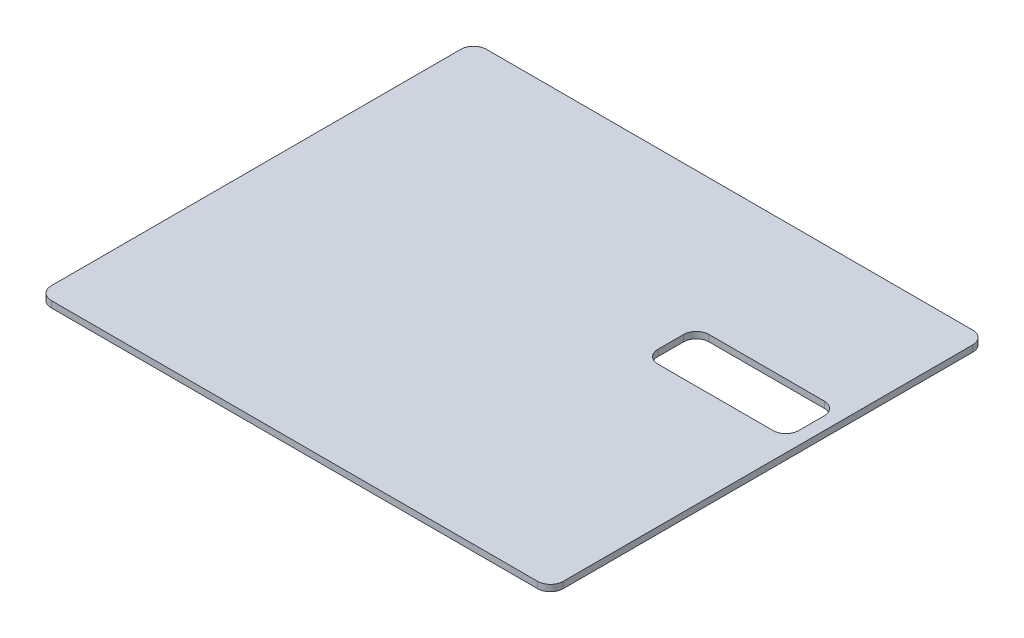
ISO-10303-21;
HEADER;
FILE_DESCRIPTION(('STEP AP214'),'2;1');
FILE_NAME('part.step','',(''),(''),'','','');
FILE_SCHEMA(('AUTOMOTIVE_DESIGN { 1 0 10303 214 1 1 1 1 }'));
ENDSEC;
DATA;
#1=APPLICATION_CONTEXT('core data for automotive mechanical design processes');
#2=APPLICATION_PROTOCOL_DEFINITION('international standard','automotive_design',2000,#1);
#3=PRODUCT_CONTEXT('',#1,'mechanical');
#4=PRODUCT('Part','Part','',(#3));
#5=PRODUCT_RELATED_PRODUCT_CATEGORY('part','',(#4));
#6=PRODUCT_DEFINITION_FORMATION('','',#4);
#7=PRODUCT_DEFINITION_CONTEXT('part definition',#1,'design');
#8=PRODUCT_DEFINITION('design','',#6,#7);
#9=PRODUCT_DEFINITION_SHAPE('','',#8);
#10=(LENGTH_UNIT() NAMED_UNIT(*) SI_UNIT(.MILLI.,.METRE.));
#11=(NAMED_UNIT(*) PLANE_ANGLE_UNIT() SI_UNIT($,.RADIAN.));
#12=(NAMED_UNIT(*) SI_UNIT($,.STERADIAN.) SOLID_ANGLE_UNIT());
#13=UNCERTAINTY_MEASURE_WITH_UNIT(LENGTH_MEASURE(1.E-05),#10,'distance_accuracy_value','');
#14=(GEOMETRIC_REPRESENTATION_CONTEXT(3) GLOBAL_UNCERTAINTY_ASSIGNED_CONTEXT((#13)) GLOBAL_UNIT_ASSIGNED_CONTEXT((#10,
#11,#12)) REPRESENTATION_CONTEXT('',''));
#15=CARTESIAN_POINT('',(0.,0.,0.));
#16=DIRECTION('',(0.,0.,1.));
#17=DIRECTION('',(1.,0.,0.));
#18=AXIS2_PLACEMENT_3D('',#15,#16,#17);
#19=CARTESIAN_POINT('',(0.,3.175,0.));
#20=DIRECTION('',(0.,-1.,0.));
#21=DIRECTION('',(0.,0.,-1.));
#22=AXIS2_PLACEMENT_3D('',#19,#20,#21);
#23=PLANE('',#22);
#24=DIRECTION('',(0.,0.,-1.));
#25=VECTOR('',#24,1.);
#26=CARTESIAN_POINT('',(254.,3.175,0.));
#27=LINE('',#26,#25);
#28=CARTESIAN_POINT('',(254.,3.175,-6.34999999999999));
#29=VERTEX_POINT('',#28);
#30=CARTESIAN_POINT('',(254.,3.175,-209.55));
#31=VERTEX_POINT('',#30);
#32=EDGE_CURVE('E179',#29,#31,#27,.T.);
#33=ORIENTED_EDGE('',*,*,#32,.T.);
#34=CARTESIAN_POINT('',(247.65,3.175,-209.55));
#35=DIRECTION('',(0.,-1.,0.));
#36=DIRECTION('',(0.,0.,-1.));
#37=AXIS2_PLACEMENT_3D('',#34,#35,#36);
#38=CIRCLE('',#37,6.35);
#39=CARTESIAN_POINT('',(247.65,3.175,-215.9));
#40=VERTEX_POINT('',#39);
#41=EDGE_CURVE('E221',#31,#40,#38,.F.);
#42=ORIENTED_EDGE('',*,*,#41,.T.);
#43=DIRECTION('',(-1.,0.,0.));
#44=VECTOR('',#43,1.);
#45=CARTESIAN_POINT('',(0.,3.175,-215.9));
#46=LINE('',#45,#44);
#47=CARTESIAN_POINT('',(6.35,3.175,-215.9));
#48=VERTEX_POINT('',#47);
#49=EDGE_CURVE('E174',#40,#48,#46,.T.);
#50=ORIENTED_EDGE('',*,*,#49,.T.);
#51=CARTESIAN_POINT('',(6.35,3.175,-209.55));
#52=DIRECTION('',(0.,-1.,0.));
#53=DIRECTION('',(0.,0.,-1.));
#54=AXIS2_PLACEMENT_3D('',#51,#52,#53);
#55=CIRCLE('',#54,6.35);
#56=CARTESIAN_POINT('',(0.,3.175,-209.55));
#57=VERTEX_POINT('',#56);
#58=EDGE_CURVE('E219',#48,#57,#55,.F.);
#59=ORIENTED_EDGE('',*,*,#58,.T.);
#60=DIRECTION('',(0.,0.,1.));
#61=VECTOR('',#60,1.);
#62=CARTESIAN_POINT('',(0.,3.175,0.));
#63=LINE('',#62,#61);
#64=CARTESIAN_POINT('',(0.,3.175,-6.35));
#65=VERTEX_POINT('',#64);
#66=EDGE_CURVE('E271',#57,#65,#63,.T.);
#67=ORIENTED_EDGE('',*,*,#66,.T.);
#68=CARTESIAN_POINT('',(6.35,3.175,-6.35));
#69=DIRECTION('',(0.,-1.,0.));
#70=DIRECTION('',(0.,0.,-1.));
#71=AXIS2_PLACEMENT_3D('',#68,#69,#70);
#72=CIRCLE('',#71,6.35);
#73=CARTESIAN_POINT('',(6.35,3.175,0.));
#74=VERTEX_POINT('',#73);
#75=EDGE_CURVE('E59',#65,#74,#72,.F.);
#76=ORIENTED_EDGE('',*,*,#75,.T.);
#77=DIRECTION('',(1.,0.,0.));
#78=VECTOR('',#77,1.);
#79=CARTESIAN_POINT('',(0.,3.175,0.));
#80=LINE('',#79,#78);
#81=CARTESIAN_POINT('',(247.65,3.175,0.));
#82=VERTEX_POINT('',#81);
#83=EDGE_CURVE('E273',#74,#82,#80,.T.);
#84=ORIENTED_EDGE('',*,*,#83,.T.);
#85=CARTESIAN_POINT('',(247.65,3.175,-6.34999999999999));
#86=DIRECTION('',(0.,-1.,0.));
#87=DIRECTION('',(0.,0.,-1.));
#88=AXIS2_PLACEMENT_3D('',#85,#86,#87);
#89=CIRCLE('',#88,6.35);
#90=EDGE_CURVE('E216',#82,#29,#89,.F.);
#91=ORIENTED_EDGE('',*,*,#90,.T.);
#92=EDGE_LOOP('',(#33,#42,#50,#59,#67,#76,#84,#91));
#93=FACE_BOUND('',#92,.T.);
#94=DIRECTION('',(0.,0.,1.));
#95=VECTOR('',#94,1.);
#96=CARTESIAN_POINT('',(177.8,3.175,-123.19));
#97=LINE('',#96,#95);
#98=CARTESIAN_POINT('',(177.8,3.175,-142.24));
#99=VERTEX_POINT('',#98);
#100=CARTESIAN_POINT('',(177.8,3.175,-129.54));
#101=VERTEX_POINT('',#100);
#102=EDGE_CURVE('E250',#99,#101,#97,.T.);
#103=ORIENTED_EDGE('',*,*,#102,.F.);
#104=CARTESIAN_POINT('',(184.15,3.175,-142.24));
#105=DIRECTION('',(0.,-1.,0.));
#106=DIRECTION('',(0.,0.,-1.));
#107=AXIS2_PLACEMENT_3D('',#104,#105,#106);
#108=CIRCLE('',#107,6.35);
#109=CARTESIAN_POINT('',(184.15,3.175,-148.59));
#110=VERTEX_POINT('',#109);
#111=EDGE_CURVE('E161',#99,#110,#108,.T.);
#112=ORIENTED_EDGE('',*,*,#111,.T.);
#113=DIRECTION('',(-1.,0.,0.));
#114=VECTOR('',#113,1.);
#115=CARTESIAN_POINT('',(247.65,3.175,-148.59));
#116=LINE('',#115,#114);
#117=CARTESIAN_POINT('',(241.3,3.175,-148.59));
#118=VERTEX_POINT('',#117);
#119=EDGE_CURVE('E247',#118,#110,#116,.T.);
#120=ORIENTED_EDGE('',*,*,#119,.F.);
#121=CARTESIAN_POINT('',(241.3,3.175,-142.24));
#122=DIRECTION('',(0.,-1.,0.));
#123=DIRECTION('',(0.,0.,-1.));
#124=AXIS2_PLACEMENT_3D('',#121,#122,#123);
#125=CIRCLE('',#124,6.35);
#126=CARTESIAN_POINT('',(247.65,3.175,-142.24));
#127=VERTEX_POINT('',#126);
#128=EDGE_CURVE('E238',#118,#127,#125,.T.);
#129=ORIENTED_EDGE('',*,*,#128,.T.);
#130=DIRECTION('',(0.,0.,-1.));
#131=VECTOR('',#130,1.);
#132=CARTESIAN_POINT('',(247.65,3.175,-123.19));
#133=LINE('',#132,#131);
#134=CARTESIAN_POINT('',(247.65,3.175,-129.54));
#135=VERTEX_POINT('',#134);
#136=EDGE_CURVE('E260',#135,#127,#133,.T.);
#137=ORIENTED_EDGE('',*,*,#136,.F.);
#138=CARTESIAN_POINT('',(241.3,3.175,-129.54));
#139=DIRECTION('',(0.,-1.,0.));
#140=DIRECTION('',(0.,0.,-1.));
#141=AXIS2_PLACEMENT_3D('',#138,#139,#140);
#142=CIRCLE('',#141,6.35);
#143=CARTESIAN_POINT('',(241.3,3.175,-123.19));
#144=VERTEX_POINT('',#143);
#145=EDGE_CURVE('E234',#135,#144,#142,.T.);
#146=ORIENTED_EDGE('',*,*,#145,.T.);
#147=DIRECTION('',(1.,0.,0.));
#148=VECTOR('',#147,1.);
#149=CARTESIAN_POINT('',(247.65,3.175,-123.19));
#150=LINE('',#149,#148);
#151=CARTESIAN_POINT('',(184.15,3.175,-123.19));
#152=VERTEX_POINT('',#151);
#153=EDGE_CURVE('E480',#152,#144,#150,.T.);
#154=ORIENTED_EDGE('',*,*,#153,.F.);
#155=CARTESIAN_POINT('',(184.15,3.175,-129.54));
#156=DIRECTION('',(0.,-1.,0.));
#157=DIRECTION('',(0.,0.,-1.));
#158=AXIS2_PLACEMENT_3D('',#155,#156,#157);
#159=CIRCLE('',#158,6.35);
#160=EDGE_CURVE('E11',#152,#101,#159,.T.);
#161=ORIENTED_EDGE('',*,*,#160,.T.);
#162=EDGE_LOOP('',(#103,#112,#120,#129,#137,#146,#154,#161));
#163=FACE_BOUND('',#162,.T.);
#164=ADVANCED_FACE('F37',(#93,#163),#23,.F.);
#165=CARTESIAN_POINT('',(0.,0.,0.));
#166=DIRECTION('',(0.,-1.,0.));
#167=DIRECTION('',(0.,0.,-1.));
#168=AXIS2_PLACEMENT_3D('',#165,#166,#167);
#169=PLANE('',#168);
#170=DIRECTION('',(-1.,0.,0.));
#171=VECTOR('',#170,1.);
#172=CARTESIAN_POINT('',(0.,0.,-215.9));
#173=LINE('',#172,#171);
#174=CARTESIAN_POINT('',(247.65,0.,-215.9));
#175=VERTEX_POINT('',#174);
#176=CARTESIAN_POINT('',(6.35,0.,-215.9));
#177=VERTEX_POINT('',#176);
#178=EDGE_CURVE('E182',#175,#177,#173,.T.);
#179=ORIENTED_EDGE('',*,*,#178,.F.);
#180=CARTESIAN_POINT('',(247.65,0.,-209.55));
#181=DIRECTION('',(0.,-1.,0.));
#182=DIRECTION('',(0.,0.,-1.));
#183=AXIS2_PLACEMENT_3D('',#180,#181,#182);
#184=CIRCLE('',#183,6.35);
#185=CARTESIAN_POINT('',(254.,0.,-209.55));
#186=VERTEX_POINT('',#185);
#187=EDGE_CURVE('E209',#175,#186,#184,.T.);
#188=ORIENTED_EDGE('',*,*,#187,.T.);
#189=DIRECTION('',(0.,0.,-1.));
#190=VECTOR('',#189,1.);
#191=CARTESIAN_POINT('',(254.,0.,-148.59));
#192=LINE('',#191,#190);
#193=CARTESIAN_POINT('',(254.,0.,-6.34999999999999));
#194=VERTEX_POINT('',#193);
#195=EDGE_CURVE('E280',#194,#186,#192,.T.);
#196=ORIENTED_EDGE('',*,*,#195,.F.);
#197=CARTESIAN_POINT('',(247.65,0.,-6.34999999999999));
#198=DIRECTION('',(0.,-1.,0.));
#199=DIRECTION('',(0.,0.,-1.));
#200=AXIS2_PLACEMENT_3D('',#197,#198,#199);
#201=CIRCLE('',#200,6.35);
#202=CARTESIAN_POINT('',(247.65,0.,0.));
#203=VERTEX_POINT('',#202);
#204=EDGE_CURVE('E203',#194,#203,#201,.T.);
#205=ORIENTED_EDGE('',*,*,#204,.T.);
#206=DIRECTION('',(1.,0.,0.));
#207=VECTOR('',#206,1.);
#208=CARTESIAN_POINT('',(0.,0.,0.));
#209=LINE('',#208,#207);
#210=CARTESIAN_POINT('',(6.35,0.,0.));
#211=VERTEX_POINT('',#210);
#212=EDGE_CURVE('E279',#211,#203,#209,.T.);
#213=ORIENTED_EDGE('',*,*,#212,.F.);
#214=CARTESIAN_POINT('',(6.35,0.,-6.35));
#215=DIRECTION('',(0.,-1.,0.));
#216=DIRECTION('',(0.,0.,-1.));
#217=AXIS2_PLACEMENT_3D('',#214,#215,#216);
#218=CIRCLE('',#217,6.35);
#219=CARTESIAN_POINT('',(0.,0.,-6.35));
#220=VERTEX_POINT('',#219);
#221=EDGE_CURVE('E205',#211,#220,#218,.T.);
#222=ORIENTED_EDGE('',*,*,#221,.T.);
#223=DIRECTION('',(0.,0.,1.));
#224=VECTOR('',#223,1.);
#225=CARTESIAN_POINT('',(0.,0.,0.));
#226=LINE('',#225,#224);
#227=CARTESIAN_POINT('',(0.,0.,-209.55));
#228=VERTEX_POINT('',#227);
#229=EDGE_CURVE('E259',#228,#220,#226,.T.);
#230=ORIENTED_EDGE('',*,*,#229,.F.);
#231=CARTESIAN_POINT('',(6.35,0.,-209.55));
#232=DIRECTION('',(0.,-1.,0.));
#233=DIRECTION('',(0.,0.,-1.));
#234=AXIS2_PLACEMENT_3D('',#231,#232,#233);
#235=CIRCLE('',#234,6.35);
#236=EDGE_CURVE('E207',#228,#177,#235,.T.);
#237=ORIENTED_EDGE('',*,*,#236,.T.);
#238=EDGE_LOOP('',(#179,#188,#196,#205,#213,#222,#230,#237));
#239=FACE_BOUND('',#238,.T.);
#240=DIRECTION('',(0.,0.,-1.));
#241=VECTOR('',#240,1.);
#242=CARTESIAN_POINT('',(247.65,0.,-123.19));
#243=LINE('',#242,#241);
#244=CARTESIAN_POINT('',(247.65,0.,-129.54));
#245=VERTEX_POINT('',#244);
#246=CARTESIAN_POINT('',(247.65,0.,-142.24));
#247=VERTEX_POINT('',#246);
#248=EDGE_CURVE('E170',#245,#247,#243,.T.);
#249=ORIENTED_EDGE('',*,*,#248,.T.);
#250=CARTESIAN_POINT('',(241.3,0.,-142.24));
#251=DIRECTION('',(0.,-1.,0.));
#252=DIRECTION('',(0.,0.,-1.));
#253=AXIS2_PLACEMENT_3D('',#250,#251,#252);
#254=CIRCLE('',#253,6.35);
#255=CARTESIAN_POINT('',(241.3,0.,-148.59));
#256=VERTEX_POINT('',#255);
#257=EDGE_CURVE('E236',#247,#256,#254,.F.);
#258=ORIENTED_EDGE('',*,*,#257,.T.);
#259=DIRECTION('',(-1.,0.,0.));
#260=VECTOR('',#259,1.);
#261=CARTESIAN_POINT('',(247.65,0.,-148.59));
#262=LINE('',#261,#260);
#263=CARTESIAN_POINT('',(184.15,0.,-148.59));
#264=VERTEX_POINT('',#263);
#265=EDGE_CURVE('E263',#256,#264,#262,.T.);
#266=ORIENTED_EDGE('',*,*,#265,.T.);
#267=CARTESIAN_POINT('',(184.15,0.,-142.24));
#268=DIRECTION('',(0.,-1.,0.));
#269=DIRECTION('',(0.,0.,-1.));
#270=AXIS2_PLACEMENT_3D('',#267,#268,#269);
#271=CIRCLE('',#270,6.35);
#272=CARTESIAN_POINT('',(177.8,0.,-142.24));
#273=VERTEX_POINT('',#272);
#274=EDGE_CURVE('E240',#264,#273,#271,.F.);
#275=ORIENTED_EDGE('',*,*,#274,.T.);
#276=DIRECTION('',(0.,0.,1.));
#277=VECTOR('',#276,1.);
#278=CARTESIAN_POINT('',(177.8,0.,-123.19));
#279=LINE('',#278,#277);
#280=CARTESIAN_POINT('',(177.8,0.,-129.54));
#281=VERTEX_POINT('',#280);
#282=EDGE_CURVE('E156',#273,#281,#279,.T.);
#283=ORIENTED_EDGE('',*,*,#282,.T.);
#284=CARTESIAN_POINT('',(184.15,0.,-129.54));
#285=DIRECTION('',(0.,-1.,0.));
#286=DIRECTION('',(0.,0.,-1.));
#287=AXIS2_PLACEMENT_3D('',#284,#285,#286);
#288=CIRCLE('',#287,6.35);
#289=CARTESIAN_POINT('',(184.15,0.,-123.19));
#290=VERTEX_POINT('',#289);
#291=EDGE_CURVE('E45',#281,#290,#288,.F.);
#292=ORIENTED_EDGE('',*,*,#291,.T.);
#293=DIRECTION('',(1.,0.,0.));
#294=VECTOR('',#293,1.);
#295=CARTESIAN_POINT('',(247.65,0.,-123.19));
#296=LINE('',#295,#294);
#297=CARTESIAN_POINT('',(241.3,0.,-123.19));
#298=VERTEX_POINT('',#297);
#299=EDGE_CURVE('E154',#290,#298,#296,.T.);
#300=ORIENTED_EDGE('',*,*,#299,.T.);
#301=CARTESIAN_POINT('',(241.3,0.,-129.54));
#302=DIRECTION('',(0.,-1.,0.));
#303=DIRECTION('',(0.,0.,-1.));
#304=AXIS2_PLACEMENT_3D('',#301,#302,#303);
#305=CIRCLE('',#304,6.35);
#306=EDGE_CURVE('E232',#298,#245,#305,.F.);
#307=ORIENTED_EDGE('',*,*,#306,.T.);
#308=EDGE_LOOP('',(#249,#258,#266,#275,#283,#292,#300,#307));
#309=FACE_BOUND('',#308,.T.);
#310=ADVANCED_FACE('F153',(#239,#309),#169,.T.);
#311=CARTESIAN_POINT('',(0.,3.175,0.));
#312=DIRECTION('',(1.,0.,0.));
#313=DIRECTION('',(0.,0.,-1.));
#314=AXIS2_PLACEMENT_3D('',#311,#312,#313);
#315=PLANE('',#314);
#316=ORIENTED_EDGE('',*,*,#66,.F.);
#317=DIRECTION('',(0.,-1.,0.));
#318=VECTOR('',#317,1.);
#319=CARTESIAN_POINT('',(0.,3.175,-209.55));
#320=LINE('',#319,#318);
#321=EDGE_CURVE('E225',#57,#228,#320,.T.);
#322=ORIENTED_EDGE('',*,*,#321,.T.);
#323=ORIENTED_EDGE('',*,*,#229,.T.);
#324=DIRECTION('',(0.,-1.,0.));
#325=VECTOR('',#324,1.);
#326=CARTESIAN_POINT('',(0.,3.175,-6.35));
#327=LINE('',#326,#325);
#328=EDGE_CURVE('E223',#220,#65,#327,.F.);
#329=ORIENTED_EDGE('',*,*,#328,.T.);
#330=EDGE_LOOP('',(#316,#322,#323,#329));
#331=FACE_BOUND('',#330,.T.);
#332=ADVANCED_FACE('F299',(#331),#315,.F.);
#333=CARTESIAN_POINT('',(0.,3.175,0.));
#334=DIRECTION('',(0.,0.,-1.));
#335=DIRECTION('',(-1.,0.,0.));
#336=AXIS2_PLACEMENT_3D('',#333,#334,#335);
#337=PLANE('',#336);
#338=ORIENTED_EDGE('',*,*,#83,.F.);
#339=DIRECTION('',(0.,-1.,0.));
#340=VECTOR('',#339,1.);
#341=CARTESIAN_POINT('',(6.35,3.175,0.));
#342=LINE('',#341,#340);
#343=EDGE_CURVE('E229',#74,#211,#342,.T.);
#344=ORIENTED_EDGE('',*,*,#343,.T.);
#345=ORIENTED_EDGE('',*,*,#212,.T.);
#346=DIRECTION('',(0.,-1.,0.));
#347=VECTOR('',#346,1.);
#348=CARTESIAN_POINT('',(247.65,3.175,0.));
#349=LINE('',#348,#347);
#350=EDGE_CURVE('E52',#203,#82,#349,.F.);
#351=ORIENTED_EDGE('',*,*,#350,.T.);
#352=EDGE_LOOP('',(#338,#344,#345,#351));
#353=FACE_BOUND('',#352,.T.);
#354=ADVANCED_FACE('F306',(#353),#337,.F.);
#355=CARTESIAN_POINT('',(254.,3.175,-148.59));
#356=DIRECTION('',(-1.,0.,0.));
#357=DIRECTION('',(0.,0.,1.));
#358=AXIS2_PLACEMENT_3D('',#355,#356,#357);
#359=PLANE('',#358);
#360=ORIENTED_EDGE('',*,*,#195,.T.);
#361=DIRECTION('',(0.,-1.,0.));
#362=VECTOR('',#361,1.);
#363=CARTESIAN_POINT('',(254.,3.175,-209.55));
#364=LINE('',#363,#362);
#365=EDGE_CURVE('E214',#186,#31,#364,.F.);
#366=ORIENTED_EDGE('',*,*,#365,.T.);
#367=ORIENTED_EDGE('',*,*,#32,.F.);
#368=DIRECTION('',(0.,-1.,0.));
#369=VECTOR('',#368,1.);
#370=CARTESIAN_POINT('',(254.,3.175,-6.34999999999999));
#371=LINE('',#370,#369);
#372=EDGE_CURVE('E211',#29,#194,#371,.T.);
#373=ORIENTED_EDGE('',*,*,#372,.T.);
#374=EDGE_LOOP('',(#360,#366,#367,#373));
#375=FACE_BOUND('',#374,.T.);
#376=ADVANCED_FACE('F311',(#375),#359,.F.);
#377=CARTESIAN_POINT('',(0.,3.175,-215.9));
#378=DIRECTION('',(0.,0.,1.));
#379=DIRECTION('',(1.,0.,0.));
#380=AXIS2_PLACEMENT_3D('',#377,#378,#379);
#381=PLANE('',#380);
#382=ORIENTED_EDGE('',*,*,#49,.F.);
#383=DIRECTION('',(0.,-1.,0.));
#384=VECTOR('',#383,1.);
#385=CARTESIAN_POINT('',(247.65,3.175,-215.9));
#386=LINE('',#385,#384);
#387=EDGE_CURVE('E200',#40,#175,#386,.T.);
#388=ORIENTED_EDGE('',*,*,#387,.T.);
#389=ORIENTED_EDGE('',*,*,#178,.T.);
#390=DIRECTION('',(0.,-1.,0.));
#391=VECTOR('',#390,1.);
#392=CARTESIAN_POINT('',(6.35,3.175,-215.9));
#393=LINE('',#392,#391);
#394=EDGE_CURVE('E198',#177,#48,#393,.F.);
#395=ORIENTED_EDGE('',*,*,#394,.T.);
#396=EDGE_LOOP('',(#382,#388,#389,#395));
#397=FACE_BOUND('',#396,.T.);
#398=ADVANCED_FACE('F290',(#397),#381,.F.);
#399=CARTESIAN_POINT('',(177.8,3.175,-123.19));
#400=DIRECTION('',(1.,0.,0.));
#401=DIRECTION('',(0.,0.,-1.));
#402=AXIS2_PLACEMENT_3D('',#399,#400,#401);
#403=PLANE('',#402);
#404=ORIENTED_EDGE('',*,*,#282,.F.);
#405=DIRECTION('',(0.,-1.,0.));
#406=VECTOR('',#405,1.);
#407=CARTESIAN_POINT('',(177.8,3.175,-142.24));
#408=LINE('',#407,#406);
#409=EDGE_CURVE('E196',#273,#99,#408,.F.);
#410=ORIENTED_EDGE('',*,*,#409,.T.);
#411=ORIENTED_EDGE('',*,*,#102,.T.);
#412=DIRECTION('',(0.,-1.,0.));
#413=VECTOR('',#412,1.);
#414=CARTESIAN_POINT('',(177.8,0.,-129.54));
#415=LINE('',#414,#413);
#416=EDGE_CURVE('E194',#101,#281,#415,.T.);
#417=ORIENTED_EDGE('',*,*,#416,.T.);
#418=EDGE_LOOP('',(#404,#410,#411,#417));
#419=FACE_BOUND('',#418,.T.);
#420=ADVANCED_FACE('F265',(#419),#403,.T.);
#421=CARTESIAN_POINT('',(247.65,3.175,-123.19));
#422=DIRECTION('',(0.,0.,-1.));
#423=DIRECTION('',(-1.,0.,0.));
#424=AXIS2_PLACEMENT_3D('',#421,#422,#423);
#425=PLANE('',#424);
#426=ORIENTED_EDGE('',*,*,#153,.T.);
#427=DIRECTION('',(0.,-1.,0.));
#428=VECTOR('',#427,1.);
#429=CARTESIAN_POINT('',(241.3,0.,-123.19));
#430=LINE('',#429,#428);
#431=EDGE_CURVE('E169',#144,#298,#430,.T.);
#432=ORIENTED_EDGE('',*,*,#431,.T.);
#433=ORIENTED_EDGE('',*,*,#299,.F.);
#434=DIRECTION('',(0.,-1.,0.));
#435=VECTOR('',#434,1.);
#436=CARTESIAN_POINT('',(184.15,3.175,-123.19));
#437=LINE('',#436,#435);
#438=EDGE_CURVE('E166',#290,#152,#437,.F.);
#439=ORIENTED_EDGE('',*,*,#438,.T.);
#440=EDGE_LOOP('',(#426,#432,#433,#439));
#441=FACE_BOUND('',#440,.T.);
#442=ADVANCED_FACE('F165',(#441),#425,.T.);
#443=CARTESIAN_POINT('',(247.65,3.175,-123.19));
#444=DIRECTION('',(-1.,0.,0.));
#445=DIRECTION('',(0.,0.,1.));
#446=AXIS2_PLACEMENT_3D('',#443,#444,#445);
#447=PLANE('',#446);
#448=ORIENTED_EDGE('',*,*,#248,.F.);
#449=DIRECTION('',(0.,-1.,0.));
#450=VECTOR('',#449,1.);
#451=CARTESIAN_POINT('',(247.65,3.175,-129.54));
#452=LINE('',#451,#450);
#453=EDGE_CURVE('E187',#245,#135,#452,.F.);
#454=ORIENTED_EDGE('',*,*,#453,.T.);
#455=ORIENTED_EDGE('',*,*,#136,.T.);
#456=DIRECTION('',(0.,-1.,0.));
#457=VECTOR('',#456,1.);
#458=CARTESIAN_POINT('',(247.65,0.,-142.24));
#459=LINE('',#458,#457);
#460=EDGE_CURVE('E176',#127,#247,#459,.T.);
#461=ORIENTED_EDGE('',*,*,#460,.T.);
#462=EDGE_LOOP('',(#448,#454,#455,#461));
#463=FACE_BOUND('',#462,.T.);
#464=ADVANCED_FACE('F405',(#463),#447,.T.);
#465=CARTESIAN_POINT('',(247.65,3.175,-148.59));
#466=DIRECTION('',(0.,0.,1.));
#467=DIRECTION('',(1.,0.,0.));
#468=AXIS2_PLACEMENT_3D('',#465,#466,#467);
#469=PLANE('',#468);
#470=ORIENTED_EDGE('',*,*,#265,.F.);
#471=DIRECTION('',(0.,-1.,0.));
#472=VECTOR('',#471,1.);
#473=CARTESIAN_POINT('',(241.3,3.175,-148.59));
#474=LINE('',#473,#472);
#475=EDGE_CURVE('E192',#256,#118,#474,.F.);
#476=ORIENTED_EDGE('',*,*,#475,.T.);
#477=ORIENTED_EDGE('',*,*,#119,.T.);
#478=DIRECTION('',(0.,-1.,0.));
#479=VECTOR('',#478,1.);
#480=CARTESIAN_POINT('',(184.15,0.,-148.59));
#481=LINE('',#480,#479);
#482=EDGE_CURVE('E189',#110,#264,#481,.T.);
#483=ORIENTED_EDGE('',*,*,#482,.T.);
#484=EDGE_LOOP('',(#470,#476,#477,#483));
#485=FACE_BOUND('',#484,.T.);
#486=ADVANCED_FACE('F256',(#485),#469,.T.);
#487=CARTESIAN_POINT('',(241.3,3.175,-129.54));
#488=DIRECTION('',(0.,1.,0.));
#489=DIRECTION('',(0.,0.,1.));
#490=AXIS2_PLACEMENT_3D('',#487,#488,#489);
#491=CYLINDRICAL_SURFACE('',#490,6.35);
#492=ORIENTED_EDGE('',*,*,#145,.F.);
#493=ORIENTED_EDGE('',*,*,#453,.F.);
#494=ORIENTED_EDGE('',*,*,#306,.F.);
#495=ORIENTED_EDGE('',*,*,#431,.F.);
#496=EDGE_LOOP('',(#492,#493,#494,#495));
#497=FACE_BOUND('',#496,.T.);
#498=ADVANCED_FACE('F340',(#497),#491,.F.);
#499=CARTESIAN_POINT('',(241.3,3.175,-142.24));
#500=DIRECTION('',(0.,1.,0.));
#501=DIRECTION('',(0.,0.,1.));
#502=AXIS2_PLACEMENT_3D('',#499,#500,#501);
#503=CYLINDRICAL_SURFACE('',#502,6.35);
#504=ORIENTED_EDGE('',*,*,#128,.F.);
#505=ORIENTED_EDGE('',*,*,#475,.F.);
#506=ORIENTED_EDGE('',*,*,#257,.F.);
#507=ORIENTED_EDGE('',*,*,#460,.F.);
#508=EDGE_LOOP('',(#504,#505,#506,#507));
#509=FACE_BOUND('',#508,.T.);
#510=ADVANCED_FACE('F343',(#509),#503,.F.);
#511=CARTESIAN_POINT('',(184.15,3.175,-142.24));
#512=DIRECTION('',(0.,1.,0.));
#513=DIRECTION('',(0.,0.,1.));
#514=AXIS2_PLACEMENT_3D('',#511,#512,#513);
#515=CYLINDRICAL_SURFACE('',#514,6.35);
#516=ORIENTED_EDGE('',*,*,#111,.F.);
#517=ORIENTED_EDGE('',*,*,#409,.F.);
#518=ORIENTED_EDGE('',*,*,#274,.F.);
#519=ORIENTED_EDGE('',*,*,#482,.F.);
#520=EDGE_LOOP('',(#516,#517,#518,#519));
#521=FACE_BOUND('',#520,.T.);
#522=ADVANCED_FACE('F262',(#521),#515,.F.);
#523=CARTESIAN_POINT('',(184.15,3.175,-129.54));
#524=DIRECTION('',(0.,1.,0.));
#525=DIRECTION('',(0.,0.,1.));
#526=AXIS2_PLACEMENT_3D('',#523,#524,#525);
#527=CYLINDRICAL_SURFACE('',#526,6.35);
#528=ORIENTED_EDGE('',*,*,#160,.F.);
#529=ORIENTED_EDGE('',*,*,#438,.F.);
#530=ORIENTED_EDGE('',*,*,#291,.F.);
#531=ORIENTED_EDGE('',*,*,#416,.F.);
#532=EDGE_LOOP('',(#528,#529,#530,#531));
#533=FACE_BOUND('',#532,.T.);
#534=ADVANCED_FACE('F173',(#533),#527,.F.);
#535=CARTESIAN_POINT('',(247.65,3.175,-209.55));
#536=DIRECTION('',(0.,-1.,0.));
#537=DIRECTION('',(0.,0.,-1.));
#538=AXIS2_PLACEMENT_3D('',#535,#536,#537);
#539=CYLINDRICAL_SURFACE('',#538,6.35);
#540=ORIENTED_EDGE('',*,*,#41,.F.);
#541=ORIENTED_EDGE('',*,*,#365,.F.);
#542=ORIENTED_EDGE('',*,*,#187,.F.);
#543=ORIENTED_EDGE('',*,*,#387,.F.);
#544=EDGE_LOOP('',(#540,#541,#542,#543));
#545=FACE_BOUND('',#544,.T.);
#546=ADVANCED_FACE('F314',(#545),#539,.T.);
#547=CARTESIAN_POINT('',(6.35,3.175,-209.55));
#548=DIRECTION('',(0.,-1.,0.));
#549=DIRECTION('',(0.,0.,-1.));
#550=AXIS2_PLACEMENT_3D('',#547,#548,#549);
#551=CYLINDRICAL_SURFACE('',#550,6.35);
#552=ORIENTED_EDGE('',*,*,#58,.F.);
#553=ORIENTED_EDGE('',*,*,#394,.F.);
#554=ORIENTED_EDGE('',*,*,#236,.F.);
#555=ORIENTED_EDGE('',*,*,#321,.F.);
#556=EDGE_LOOP('',(#552,#553,#554,#555));
#557=FACE_BOUND('',#556,.T.);
#558=ADVANCED_FACE('F295',(#557),#551,.T.);
#559=CARTESIAN_POINT('',(6.35,3.175,-6.35));
#560=DIRECTION('',(0.,-1.,0.));
#561=DIRECTION('',(0.,0.,-1.));
#562=AXIS2_PLACEMENT_3D('',#559,#560,#561);
#563=CYLINDRICAL_SURFACE('',#562,6.35);
#564=ORIENTED_EDGE('',*,*,#75,.F.);
#565=ORIENTED_EDGE('',*,*,#328,.F.);
#566=ORIENTED_EDGE('',*,*,#221,.F.);
#567=ORIENTED_EDGE('',*,*,#343,.F.);
#568=EDGE_LOOP('',(#564,#565,#566,#567));
#569=FACE_BOUND('',#568,.T.);
#570=ADVANCED_FACE('F303',(#569),#563,.T.);
#571=CARTESIAN_POINT('',(247.65,3.175,-6.34999999999999));
#572=DIRECTION('',(0.,-1.,0.));
#573=DIRECTION('',(0.,0.,-1.));
#574=AXIS2_PLACEMENT_3D('',#571,#572,#573);
#575=CYLINDRICAL_SURFACE('',#574,6.35);
#576=ORIENTED_EDGE('',*,*,#90,.F.);
#577=ORIENTED_EDGE('',*,*,#350,.F.);
#578=ORIENTED_EDGE('',*,*,#204,.F.);
#579=ORIENTED_EDGE('',*,*,#372,.F.);
#580=EDGE_LOOP('',(#576,#577,#578,#579));
#581=FACE_BOUND('',#580,.T.);
#582=ADVANCED_FACE('F39',(#581),#575,.T.);
#583=CLOSED_SHELL('',(#164,#310,#332,#354,#376,#398,#420,#442,#464,#486,#498,#510,#522,#534,
#546,#558,#570,#582));
#584=MANIFOLD_SOLID_BREP('B2',#583);
#585=ADVANCED_BREP_SHAPE_REPRESENTATION('',(#18,#584),#14);
#586=SHAPE_DEFINITION_REPRESENTATION(#9,#585);
ENDSEC;
END-ISO-10303-21;
